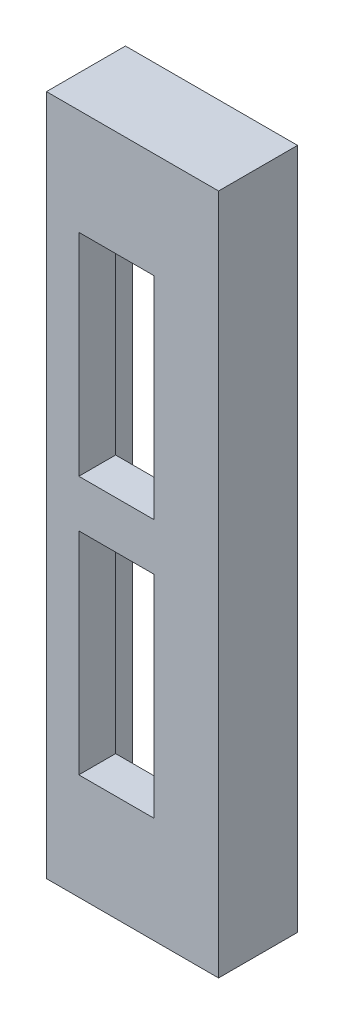
ISO-10303-21;
HEADER;
FILE_DESCRIPTION(('STEP AP214'),'2;1');
FILE_NAME('part.step','',(''),(''),'','','');
FILE_SCHEMA(('AUTOMOTIVE_DESIGN { 1 0 10303 214 1 1 1 1 }'));
ENDSEC;
DATA;
#1=APPLICATION_CONTEXT('core data for automotive mechanical design processes');
#2=APPLICATION_PROTOCOL_DEFINITION('international standard','automotive_design',2000,#1);
#3=PRODUCT_CONTEXT('',#1,'mechanical');
#4=PRODUCT('Part','Part','',(#3));
#5=PRODUCT_RELATED_PRODUCT_CATEGORY('part','',(#4));
#6=PRODUCT_DEFINITION_FORMATION('','',#4);
#7=PRODUCT_DEFINITION_CONTEXT('part definition',#1,'design');
#8=PRODUCT_DEFINITION('design','',#6,#7);
#9=PRODUCT_DEFINITION_SHAPE('','',#8);
#10=(LENGTH_UNIT() NAMED_UNIT(*) SI_UNIT(.MILLI.,.METRE.));
#11=(NAMED_UNIT(*) PLANE_ANGLE_UNIT() SI_UNIT($,.RADIAN.));
#12=(NAMED_UNIT(*) SI_UNIT($,.STERADIAN.) SOLID_ANGLE_UNIT());
#13=UNCERTAINTY_MEASURE_WITH_UNIT(LENGTH_MEASURE(1.E-05),#10,'distance_accuracy_value','');
#14=(GEOMETRIC_REPRESENTATION_CONTEXT(3) GLOBAL_UNCERTAINTY_ASSIGNED_CONTEXT((#13)) GLOBAL_UNIT_ASSIGNED_CONTEXT((#10,
#11,#12)) REPRESENTATION_CONTEXT('',''));
#15=CARTESIAN_POINT('',(0.,0.,0.));
#16=DIRECTION('',(0.,0.,1.));
#17=DIRECTION('',(1.,0.,0.));
#18=AXIS2_PLACEMENT_3D('',#15,#16,#17);
#19=CARTESIAN_POINT('',(0.,0.,3.81));
#20=DIRECTION('',(0.,0.,-1.));
#21=DIRECTION('',(-1.,0.,0.));
#22=AXIS2_PLACEMENT_3D('',#19,#20,#21);
#23=PLANE('',#22);
#24=DIRECTION('',(0.500000000000004,-0.866025403784436,0.));
#25=VECTOR('',#24,1.);
#26=CARTESIAN_POINT('',(19.9255461786053,11.5040194499682,3.81));
#27=LINE('',#26,#25);
#28=CARTESIAN_POINT('',(26.3139034313321,0.439060111344211,3.81));
#29=VERTEX_POINT('',#28);
#30=CARTESIAN_POINT('',(26.5497147250491,0.0306229696278772,3.81));
#31=VERTEX_POINT('',#30);
#32=EDGE_CURVE('E923',#29,#31,#27,.T.);
#33=ORIENTED_EDGE('',*,*,#32,.F.);
#34=DIRECTION('',(0.929308442313576,0.369304507208774,0.));
#35=VECTOR('',#34,1.);
#36=CARTESIAN_POINT('',(3.43815880907448,-8.65169513211885,3.81));
#37=LINE('',#36,#35);
#38=CARTESIAN_POINT('',(31.499999999999,2.49999999999999,3.81));
#39=VERTEX_POINT('',#38);
#40=EDGE_CURVE('E926',#29,#39,#37,.T.);
#41=ORIENTED_EDGE('',*,*,#40,.T.);
#42=DIRECTION('',(0.,1.,0.));
#43=VECTOR('',#42,1.);
#44=CARTESIAN_POINT('',(31.499999999999,2.05328178701975E-13,3.81));
#45=LINE('',#44,#43);
#46=CARTESIAN_POINT('',(31.4999999999987,35.5,3.81));
#47=VERTEX_POINT('',#46);
#48=EDGE_CURVE('E929',#39,#47,#45,.T.);
#49=ORIENTED_EDGE('',*,*,#48,.T.);
#50=DIRECTION('',(-0.929308442313484,0.369304507209006,0.));
#51=VECTOR('',#50,1.);
#52=CARTESIAN_POINT('',(16.4796750697619,41.4690340084192,3.81));
#53=LINE('',#52,#51);
#54=CARTESIAN_POINT('',(25.0832450413092,38.0500000000004,3.81));
#55=VERTEX_POINT('',#54);
#56=EDGE_CURVE('E931',#47,#55,#53,.T.);
#57=ORIENTED_EDGE('',*,*,#56,.T.);
#58=DIRECTION('',(-0.932489534644437,-0.361196993036488,0.));
#59=VECTOR('',#58,1.);
#60=CARTESIAN_POINT('',(-9.5432703123766,24.6375242987562,3.81));
#61=LINE('',#60,#59);
#62=CARTESIAN_POINT('',(18.4999999999988,35.5,3.81));
#63=VERTEX_POINT('',#62);
#64=EDGE_CURVE('E933',#55,#63,#61,.T.);
#65=ORIENTED_EDGE('',*,*,#64,.T.);
#66=DIRECTION('',(0.,-1.,0.));
#67=VECTOR('',#66,1.);
#68=CARTESIAN_POINT('',(18.499999999999,1.28369537222277E-13,3.81));
#69=LINE('',#68,#67);
#70=CARTESIAN_POINT('',(18.499999999999,2.5,3.81));
#71=VERTEX_POINT('',#70);
#72=EDGE_CURVE('E935',#63,#71,#69,.T.);
#73=ORIENTED_EDGE('',*,*,#72,.T.);
#74=DIRECTION('',(0.932489534644453,-0.361196993036448,0.));
#75=VECTOR('',#74,1.);
#76=CARTESIAN_POINT('',(3.25560149378227,8.40487152565658,3.81));
#77=LINE('',#76,#75);
#78=CARTESIAN_POINT('',(23.8467508819622,0.428952262379621,3.81));
#79=VERTEX_POINT('',#78);
#80=EDGE_CURVE('E937',#71,#79,#77,.T.);
#81=ORIENTED_EDGE('',*,*,#80,.T.);
#82=DIRECTION('',(0.499999999999997,0.866025403784441,0.));
#83=VECTOR('',#82,1.);
#84=CARTESIAN_POINT('',(17.6993213833559,-10.2187079651541,3.81));
#85=LINE('',#84,#83);
#86=CARTESIAN_POINT('',(23.6167753575658,0.030622969627879,3.81));
#87=VERTEX_POINT('',#86);
#88=EDGE_CURVE('E939',#87,#79,#85,.T.);
#89=ORIENTED_EDGE('',*,*,#88,.F.);
#90=DIRECTION('',(-0.500000000000071,0.866025403784398,0.));
#91=VECTOR('',#90,1.);
#92=CARTESIAN_POINT('',(17.7258416529912,10.2340194499691,3.81));
#93=LINE('',#92,#91);
#94=CARTESIAN_POINT('',(23.8467508819622,-0.367706323123848,3.81));
#95=VERTEX_POINT('',#94);
#96=EDGE_CURVE('E942',#95,#87,#93,.T.);
#97=ORIENTED_EDGE('',*,*,#96,.F.);
#98=DIRECTION('',(0.932489534644453,0.361196993036448,0.));
#99=VECTOR('',#98,1.);
#100=CARTESIAN_POINT('',(3.23497310101432,-8.35161593177429,3.81));
#101=LINE('',#100,#99);
#102=CARTESIAN_POINT('',(18.499999999999,-2.43875406074424,3.81));
#103=VERTEX_POINT('',#102);
#104=EDGE_CURVE('E945',#103,#95,#101,.T.);
#105=ORIENTED_EDGE('',*,*,#104,.F.);
#106=DIRECTION('',(0.,1.,0.));
#107=VECTOR('',#106,1.);
#108=CARTESIAN_POINT('',(18.499999999999,-1.28369537222277E-13,3.81));
#109=LINE('',#108,#107);
#110=CARTESIAN_POINT('',(18.4999999999988,-35.4387540607442,3.81));
#111=VERTEX_POINT('',#110);
#112=EDGE_CURVE('E948',#111,#103,#109,.T.);
#113=ORIENTED_EDGE('',*,*,#112,.F.);
#114=DIRECTION('',(-0.932489534644437,0.361196993036488,0.));
#115=VECTOR('',#114,1.);
#116=CARTESIAN_POINT('',(-9.52264191960864,-24.5842687048739,3.81));
#117=LINE('',#116,#115);
#118=CARTESIAN_POINT('',(25.0832450413092,-37.9887540607447,3.81));
#119=VERTEX_POINT('',#118);
#120=EDGE_CURVE('E951',#119,#111,#117,.T.);
#121=ORIENTED_EDGE('',*,*,#120,.F.);
#122=DIRECTION('',(-0.929308442313484,-0.369304507209006,0.));
#123=VECTOR('',#122,1.);
#124=CARTESIAN_POINT('',(16.4586555983749,-41.416141146752,3.81));
#125=LINE('',#124,#123);
#126=CARTESIAN_POINT('',(31.4999999999987,-35.4387540607442,3.81));
#127=VERTEX_POINT('',#126);
#128=EDGE_CURVE('E954',#127,#119,#125,.T.);
#129=ORIENTED_EDGE('',*,*,#128,.F.);
#130=DIRECTION('',(0.,-1.,0.));
#131=VECTOR('',#130,1.);
#132=CARTESIAN_POINT('',(31.499999999999,-2.05328178701975E-13,3.81));
#133=LINE('',#132,#131);
#134=CARTESIAN_POINT('',(31.499999999999,-2.43875406074423,3.81));
#135=VERTEX_POINT('',#134);
#136=EDGE_CURVE('E957',#135,#127,#133,.T.);
#137=ORIENTED_EDGE('',*,*,#136,.F.);
#138=DIRECTION('',(0.929308442313576,-0.369304507208774,0.));
#139=VECTOR('',#138,1.);
#140=CARTESIAN_POINT('',(3.45917828046144,8.70458799378605,3.81));
#141=LINE('',#140,#139);
#142=CARTESIAN_POINT('',(26.3139034313321,-0.377814172088448,3.81));
#143=VERTEX_POINT('',#142);
#144=EDGE_CURVE('E960',#143,#135,#141,.T.);
#145=ORIENTED_EDGE('',*,*,#144,.F.);
#146=DIRECTION('',(-0.500000000000057,-0.866025403784406,0.));
#147=VECTOR('',#146,1.);
#148=CARTESIAN_POINT('',(19.8990259089668,-11.4887079651551,3.81));
#149=LINE('',#148,#147);
#150=EDGE_CURVE('E963',#31,#143,#149,.T.);
#151=ORIENTED_EDGE('',*,*,#150,.F.);
#152=EDGE_LOOP('',(#33,#41,#49,#57,#65,#73,#81,#89,#97,#105,#113,#121,#129,#137,#145,#151));
#153=FACE_BOUND('',#152,.T.);
#154=DIRECTION('',(-1.,0.,0.));
#155=VECTOR('',#154,1.);
#156=CARTESIAN_POINT('',(0.,-49.25,3.81));
#157=LINE('',#156,#155);
#158=CARTESIAN_POINT('',(39.2,-49.25,3.81));
#159=VERTEX_POINT('',#158);
#160=CARTESIAN_POINT('',(15.7500000000006,-49.25,3.81));
#161=VERTEX_POINT('',#160);
#162=EDGE_CURVE('E918',#159,#161,#157,.T.);
#163=ORIENTED_EDGE('',*,*,#162,.T.);
#164=DIRECTION('',(0.,1.,0.));
#165=VECTOR('',#164,1.);
#166=CARTESIAN_POINT('',(15.7500000000006,0.,3.81));
#167=LINE('',#166,#165);
#168=CARTESIAN_POINT('',(15.7500000000006,49.25,3.81));
#169=VERTEX_POINT('',#168);
#170=EDGE_CURVE('E672',#161,#169,#167,.T.);
#171=ORIENTED_EDGE('',*,*,#170,.T.);
#172=DIRECTION('',(1.,0.,0.));
#173=VECTOR('',#172,1.);
#174=CARTESIAN_POINT('',(0.,49.25,3.81));
#175=LINE('',#174,#173);
#176=CARTESIAN_POINT('',(39.2,49.25,3.81));
#177=VERTEX_POINT('',#176);
#178=EDGE_CURVE('E920',#169,#177,#175,.T.);
#179=ORIENTED_EDGE('',*,*,#178,.T.);
#180=CARTESIAN_POINT('',(39.2,49.2,3.81));
#181=DIRECTION('',(0.,0.,-1.));
#182=DIRECTION('',(-1.,0.,0.));
#183=AXIS2_PLACEMENT_3D('',#180,#181,#182);
#184=CIRCLE('',#183,0.05);
#185=CARTESIAN_POINT('',(39.25,49.2,3.81));
#186=VERTEX_POINT('',#185);
#187=EDGE_CURVE('E1124',#177,#186,#184,.T.);
#188=ORIENTED_EDGE('',*,*,#187,.T.);
#189=DIRECTION('',(0.,-1.,0.));
#190=VECTOR('',#189,1.);
#191=CARTESIAN_POINT('',(39.25,0.,3.81));
#192=LINE('',#191,#190);
#193=CARTESIAN_POINT('',(39.25,-49.2,3.81));
#194=VERTEX_POINT('',#193);
#195=EDGE_CURVE('E915',#186,#194,#192,.T.);
#196=ORIENTED_EDGE('',*,*,#195,.T.);
#197=CARTESIAN_POINT('',(39.2,-49.2,3.81));
#198=DIRECTION('',(0.,0.,-1.));
#199=DIRECTION('',(-1.,0.,0.));
#200=AXIS2_PLACEMENT_3D('',#197,#198,#199);
#201=CIRCLE('',#200,0.05);
#202=EDGE_CURVE('E1126',#194,#159,#201,.T.);
#203=ORIENTED_EDGE('',*,*,#202,.T.);
#204=EDGE_LOOP('',(#163,#171,#179,#188,#196,#203));
#205=FACE_BOUND('',#204,.T.);
#206=ADVANCED_FACE('F650',(#153,#205),#23,.T.);
#207=CARTESIAN_POINT('',(0.,-49.25,3.81));
#208=DIRECTION('',(0.,-1.,0.));
#209=DIRECTION('',(0.,0.,-1.));
#210=AXIS2_PLACEMENT_3D('',#207,#208,#209);
#211=PLANE('',#210);
#212=DIRECTION('',(0.,0.,-1.));
#213=VECTOR('',#212,1.);
#214=CARTESIAN_POINT('',(15.7500000000006,-49.25,3.81));
#215=LINE('',#214,#213);
#216=CARTESIAN_POINT('',(15.7500000000006,-49.25,-6.191));
#217=VERTEX_POINT('',#216);
#218=EDGE_CURVE('E665',#161,#217,#215,.T.);
#219=ORIENTED_EDGE('',*,*,#218,.F.);
#220=ORIENTED_EDGE('',*,*,#162,.F.);
#221=DIRECTION('',(0.,0.,-1.));
#222=VECTOR('',#221,1.);
#223=CARTESIAN_POINT('',(39.2,-49.25,0.));
#224=LINE('',#223,#222);
#225=CARTESIAN_POINT('',(39.2,-49.25,-6.191));
#226=VERTEX_POINT('',#225);
#227=EDGE_CURVE('E1118',#159,#226,#224,.T.);
#228=ORIENTED_EDGE('',*,*,#227,.T.);
#229=DIRECTION('',(-1.,0.,0.));
#230=VECTOR('',#229,1.);
#231=CARTESIAN_POINT('',(39.2,-49.25,-6.191));
#232=LINE('',#231,#230);
#233=EDGE_CURVE('E904',#226,#217,#232,.T.);
#234=ORIENTED_EDGE('',*,*,#233,.T.);
#235=EDGE_LOOP('',(#219,#220,#228,#234));
#236=FACE_BOUND('',#235,.T.);
#237=ADVANCED_FACE('F1147',(#236),#211,.F.);
#238=CARTESIAN_POINT('',(0.,49.25,3.81));
#239=DIRECTION('',(0.,1.,0.));
#240=DIRECTION('',(0.,0.,1.));
#241=AXIS2_PLACEMENT_3D('',#238,#239,#240);
#242=PLANE('',#241);
#243=DIRECTION('',(0.,0.,1.));
#244=VECTOR('',#243,1.);
#245=CARTESIAN_POINT('',(15.7500000000006,49.25,3.81));
#246=LINE('',#245,#244);
#247=CARTESIAN_POINT('',(15.7500000000006,49.25,-6.191));
#248=VERTEX_POINT('',#247);
#249=EDGE_CURVE('E1153',#248,#169,#246,.T.);
#250=ORIENTED_EDGE('',*,*,#249,.F.);
#251=DIRECTION('',(1.,0.,0.));
#252=VECTOR('',#251,1.);
#253=CARTESIAN_POINT('',(-39.2,49.25,-6.191));
#254=LINE('',#253,#252);
#255=CARTESIAN_POINT('',(39.2,49.25,-6.191));
#256=VERTEX_POINT('',#255);
#257=EDGE_CURVE('E906',#248,#256,#254,.T.);
#258=ORIENTED_EDGE('',*,*,#257,.T.);
#259=DIRECTION('',(0.,0.,-1.));
#260=VECTOR('',#259,1.);
#261=CARTESIAN_POINT('',(39.2,49.25,3.81));
#262=LINE('',#261,#260);
#263=EDGE_CURVE('E658',#256,#177,#262,.F.);
#264=ORIENTED_EDGE('',*,*,#263,.T.);
#265=ORIENTED_EDGE('',*,*,#178,.F.);
#266=EDGE_LOOP('',(#250,#258,#264,#265));
#267=FACE_BOUND('',#266,.T.);
#268=ADVANCED_FACE('F1131',(#267),#242,.F.);
#269=CARTESIAN_POINT('',(14.7500000000006,52.8592862313909,5.3975));
#270=DIRECTION('',(1.,0.,0.));
#271=DIRECTION('',(0.,1.,0.));
#272=AXIS2_PLACEMENT_3D('',#269,#270,#271);
#273=PLANE('',#272);
#274=DIRECTION('',(0.,0.,1.));
#275=VECTOR('',#274,1.);
#276=CARTESIAN_POINT('',(14.7500000000006,50.,5.3975));
#277=LINE('',#276,#275);
#278=CARTESIAN_POINT('',(14.7500000000006,50.,-6.191));
#279=VERTEX_POINT('',#278);
#280=CARTESIAN_POINT('',(14.7500000000006,50.,5.3975));
#281=VERTEX_POINT('',#280);
#282=EDGE_CURVE('E891',#279,#281,#277,.T.);
#283=ORIENTED_EDGE('',*,*,#282,.F.);
#284=DIRECTION('',(0.,-1.,0.));
#285=VECTOR('',#284,1.);
#286=CARTESIAN_POINT('',(14.7500000000006,0.,-6.191));
#287=LINE('',#286,#285);
#288=CARTESIAN_POINT('',(14.7500000000006,-50.,-6.191));
#289=VERTEX_POINT('',#288);
#290=EDGE_CURVE('E12',#279,#289,#287,.T.);
#291=ORIENTED_EDGE('',*,*,#290,.T.);
#292=DIRECTION('',(0.,0.,-1.));
#293=VECTOR('',#292,1.);
#294=CARTESIAN_POINT('',(14.7500000000006,-50.,5.3975));
#295=LINE('',#294,#293);
#296=CARTESIAN_POINT('',(14.7500000000006,-50.,5.3975));
#297=VERTEX_POINT('',#296);
#298=EDGE_CURVE('E888',#297,#289,#295,.T.);
#299=ORIENTED_EDGE('',*,*,#298,.F.);
#300=DIRECTION('',(0.,-1.,0.));
#301=VECTOR('',#300,1.);
#302=CARTESIAN_POINT('',(14.7500000000006,52.8592862313909,5.3975));
#303=LINE('',#302,#301);
#304=EDGE_CURVE('E895',#281,#297,#303,.T.);
#305=ORIENTED_EDGE('',*,*,#304,.F.);
#306=EDGE_LOOP('',(#283,#291,#299,#305));
#307=FACE_BOUND('',#306,.T.);
#308=ADVANCED_FACE('F886',(#307),#273,.F.);
#309=CARTESIAN_POINT('',(0.,0.,5.3975));
#310=DIRECTION('',(0.,0.,-1.));
#311=DIRECTION('',(-1.,0.,0.));
#312=AXIS2_PLACEMENT_3D('',#309,#310,#311);
#313=PLANE('',#312);
#314=DIRECTION('',(1.,0.,0.));
#315=VECTOR('',#314,1.);
#316=CARTESIAN_POINT('',(40.,-50.,5.3975));
#317=LINE('',#316,#315);
#318=CARTESIAN_POINT('',(40.,-50.,5.3975));
#319=VERTEX_POINT('',#318);
#320=EDGE_CURVE('E894',#297,#319,#317,.T.);
#321=ORIENTED_EDGE('',*,*,#320,.T.);
#322=DIRECTION('',(0.,1.,0.));
#323=VECTOR('',#322,1.);
#324=CARTESIAN_POINT('',(40.,50.,5.3975));
#325=LINE('',#324,#323);
#326=CARTESIAN_POINT('',(40.,50.,5.3975));
#327=VERTEX_POINT('',#326);
#328=EDGE_CURVE('E1107',#319,#327,#325,.T.);
#329=ORIENTED_EDGE('',*,*,#328,.T.);
#330=DIRECTION('',(-1.,0.,0.));
#331=VECTOR('',#330,1.);
#332=CARTESIAN_POINT('',(-40.,50.,5.3975));
#333=LINE('',#332,#331);
#334=EDGE_CURVE('E1110',#327,#281,#333,.T.);
#335=ORIENTED_EDGE('',*,*,#334,.T.);
#336=ORIENTED_EDGE('',*,*,#304,.T.);
#337=EDGE_LOOP('',(#321,#329,#335,#336));
#338=FACE_BOUND('',#337,.T.);
#339=DIRECTION('',(0.,1.,0.));
#340=VECTOR('',#339,1.);
#341=CARTESIAN_POINT('',(30.499999999999,-3.43875406074425,5.3975));
#342=LINE('',#341,#340);
#343=CARTESIAN_POINT('',(30.4999999999988,-34.4387540607442,5.3975));
#344=VERTEX_POINT('',#343);
#345=CARTESIAN_POINT('',(30.499999999999,-3.43875406074425,5.3975));
#346=VERTEX_POINT('',#345);
#347=EDGE_CURVE('E1073',#344,#346,#342,.T.);
#348=ORIENTED_EDGE('',*,*,#347,.F.);
#349=DIRECTION('',(1.,0.,0.));
#350=VECTOR('',#349,1.);
#351=CARTESIAN_POINT('',(30.4999999999988,-34.4387540607442,5.3975));
#352=LINE('',#351,#350);
#353=CARTESIAN_POINT('',(19.4999999999988,-34.4387540607442,5.3975));
#354=VERTEX_POINT('',#353);
#355=EDGE_CURVE('E1080',#354,#344,#352,.T.);
#356=ORIENTED_EDGE('',*,*,#355,.F.);
#357=DIRECTION('',(0.,-1.,0.));
#358=VECTOR('',#357,1.);
#359=CARTESIAN_POINT('',(19.4999999999988,-34.4387540607442,5.3975));
#360=LINE('',#359,#358);
#361=CARTESIAN_POINT('',(19.499999999999,-3.43875406074425,5.3975));
#362=VERTEX_POINT('',#361);
#363=EDGE_CURVE('E1077',#362,#354,#360,.T.);
#364=ORIENTED_EDGE('',*,*,#363,.F.);
#365=DIRECTION('',(-1.,0.,0.));
#366=VECTOR('',#365,1.);
#367=CARTESIAN_POINT('',(19.499999999999,-3.43875406074425,5.3975));
#368=LINE('',#367,#366);
#369=EDGE_CURVE('E1075',#346,#362,#368,.T.);
#370=ORIENTED_EDGE('',*,*,#369,.F.);
#371=EDGE_LOOP('',(#348,#356,#364,#370));
#372=FACE_BOUND('',#371,.T.);
#373=DIRECTION('',(0.,-1.,0.));
#374=VECTOR('',#373,1.);
#375=CARTESIAN_POINT('',(19.4999999999988,34.5,5.3975));
#376=LINE('',#375,#374);
#377=CARTESIAN_POINT('',(19.4999999999988,34.5,5.3975));
#378=VERTEX_POINT('',#377);
#379=CARTESIAN_POINT('',(19.499999999999,3.50000000000001,5.3975));
#380=VERTEX_POINT('',#379);
#381=EDGE_CURVE('E1090',#378,#380,#376,.T.);
#382=ORIENTED_EDGE('',*,*,#381,.F.);
#383=DIRECTION('',(-1.,0.,0.));
#384=VECTOR('',#383,1.);
#385=CARTESIAN_POINT('',(30.4999999999988,34.5,5.3975));
#386=LINE('',#385,#384);
#387=CARTESIAN_POINT('',(30.4999999999988,34.5,5.3975));
#388=VERTEX_POINT('',#387);
#389=EDGE_CURVE('E1097',#388,#378,#386,.T.);
#390=ORIENTED_EDGE('',*,*,#389,.F.);
#391=DIRECTION('',(0.,1.,0.));
#392=VECTOR('',#391,1.);
#393=CARTESIAN_POINT('',(30.499999999999,3.50000000000001,5.3975));
#394=LINE('',#393,#392);
#395=CARTESIAN_POINT('',(30.499999999999,3.50000000000001,5.3975));
#396=VERTEX_POINT('',#395);
#397=EDGE_CURVE('E1094',#396,#388,#394,.T.);
#398=ORIENTED_EDGE('',*,*,#397,.F.);
#399=DIRECTION('',(1.,0.,0.));
#400=VECTOR('',#399,1.);
#401=CARTESIAN_POINT('',(19.499999999999,3.50000000000001,5.3975));
#402=LINE('',#401,#400);
#403=EDGE_CURVE('E1092',#380,#396,#402,.T.);
#404=ORIENTED_EDGE('',*,*,#403,.F.);
#405=EDGE_LOOP('',(#382,#390,#398,#404));
#406=FACE_BOUND('',#405,.T.);
#407=ADVANCED_FACE('F1175',(#338,#372,#406),#313,.F.);
#408=CARTESIAN_POINT('',(40.,50.,5.3975));
#409=DIRECTION('',(-1.,0.,0.));
#410=DIRECTION('',(0.,-1.,0.));
#411=AXIS2_PLACEMENT_3D('',#408,#409,#410);
#412=PLANE('',#411);
#413=DIRECTION('',(0.,0.,-1.));
#414=VECTOR('',#413,1.);
#415=CARTESIAN_POINT('',(40.,-50.,5.3975));
#416=LINE('',#415,#414);
#417=CARTESIAN_POINT('',(40.,-50.,-6.191));
#418=VERTEX_POINT('',#417);
#419=EDGE_CURVE('E1113',#319,#418,#416,.T.);
#420=ORIENTED_EDGE('',*,*,#419,.T.);
#421=DIRECTION('',(0.,-1.,0.));
#422=VECTOR('',#421,1.);
#423=CARTESIAN_POINT('',(40.,50.,-6.191));
#424=LINE('',#423,#422);
#425=CARTESIAN_POINT('',(40.,50.,-6.191));
#426=VERTEX_POINT('',#425);
#427=EDGE_CURVE('E877',#426,#418,#424,.T.);
#428=ORIENTED_EDGE('',*,*,#427,.F.);
#429=DIRECTION('',(0.,0.,-1.));
#430=VECTOR('',#429,1.);
#431=CARTESIAN_POINT('',(40.,50.,5.3975));
#432=LINE('',#431,#430);
#433=EDGE_CURVE('E1115',#327,#426,#432,.T.);
#434=ORIENTED_EDGE('',*,*,#433,.F.);
#435=ORIENTED_EDGE('',*,*,#328,.F.);
#436=EDGE_LOOP('',(#420,#428,#434,#435));
#437=FACE_BOUND('',#436,.T.);
#438=ADVANCED_FACE('F1183',(#437),#412,.F.);
#439=CARTESIAN_POINT('',(-40.,50.,5.3975));
#440=DIRECTION('',(0.,-1.,0.));
#441=DIRECTION('',(1.,0.,0.));
#442=AXIS2_PLACEMENT_3D('',#439,#440,#441);
#443=PLANE('',#442);
#444=ORIENTED_EDGE('',*,*,#282,.T.);
#445=ORIENTED_EDGE('',*,*,#334,.F.);
#446=ORIENTED_EDGE('',*,*,#433,.T.);
#447=DIRECTION('',(1.,0.,0.));
#448=VECTOR('',#447,1.);
#449=CARTESIAN_POINT('',(-40.,50.,-6.191));
#450=LINE('',#449,#448);
#451=EDGE_CURVE('E881',#279,#426,#450,.T.);
#452=ORIENTED_EDGE('',*,*,#451,.F.);
#453=EDGE_LOOP('',(#444,#445,#446,#452));
#454=FACE_BOUND('',#453,.T.);
#455=ADVANCED_FACE('F1180',(#454),#443,.F.);
#456=CARTESIAN_POINT('',(40.,-50.,5.3975));
#457=DIRECTION('',(0.,1.,0.));
#458=DIRECTION('',(-1.,0.,0.));
#459=AXIS2_PLACEMENT_3D('',#456,#457,#458);
#460=PLANE('',#459);
#461=ORIENTED_EDGE('',*,*,#298,.T.);
#462=DIRECTION('',(-1.,0.,0.));
#463=VECTOR('',#462,1.);
#464=CARTESIAN_POINT('',(40.,-50.,-6.191));
#465=LINE('',#464,#463);
#466=EDGE_CURVE('E872',#418,#289,#465,.T.);
#467=ORIENTED_EDGE('',*,*,#466,.F.);
#468=ORIENTED_EDGE('',*,*,#419,.F.);
#469=ORIENTED_EDGE('',*,*,#320,.F.);
#470=EDGE_LOOP('',(#461,#467,#468,#469));
#471=FACE_BOUND('',#470,.T.);
#472=ADVANCED_FACE('F893',(#471),#460,.F.);
#473=CARTESIAN_POINT('',(19.4999999999988,34.5,5.3975));
#474=DIRECTION('',(1.,0.,0.));
#475=DIRECTION('',(0.,1.,0.));
#476=AXIS2_PLACEMENT_3D('',#473,#474,#475);
#477=PLANE('',#476);
#478=DIRECTION('',(0.,0.,-1.));
#479=VECTOR('',#478,1.);
#480=CARTESIAN_POINT('',(19.499999999999,3.50000000000001,5.3975));
#481=LINE('',#480,#479);
#482=CARTESIAN_POINT('',(19.499999999999,3.50000000000001,0.));
#483=VERTEX_POINT('',#482);
#484=EDGE_CURVE('E1105',#380,#483,#481,.T.);
#485=ORIENTED_EDGE('',*,*,#484,.T.);
#486=DIRECTION('',(0.,-1.,0.));
#487=VECTOR('',#486,1.);
#488=CARTESIAN_POINT('',(19.499999999999,1.35308431126184E-13,0.));
#489=LINE('',#488,#487);
#490=CARTESIAN_POINT('',(19.4999999999988,34.5,0.));
#491=VERTEX_POINT('',#490);
#492=EDGE_CURVE('E972',#491,#483,#489,.T.);
#493=ORIENTED_EDGE('',*,*,#492,.F.);
#494=DIRECTION('',(0.,0.,-1.));
#495=VECTOR('',#494,1.);
#496=CARTESIAN_POINT('',(19.4999999999988,34.5,5.3975));
#497=LINE('',#496,#495);
#498=EDGE_CURVE('E1099',#378,#491,#497,.T.);
#499=ORIENTED_EDGE('',*,*,#498,.F.);
#500=ORIENTED_EDGE('',*,*,#381,.T.);
#501=EDGE_LOOP('',(#485,#493,#499,#500));
#502=FACE_BOUND('',#501,.T.);
#503=ADVANCED_FACE('F1179',(#502),#477,.T.);
#504=CARTESIAN_POINT('',(19.499999999999,3.50000000000001,5.3975));
#505=DIRECTION('',(0.,1.,0.));
#506=DIRECTION('',(-1.,0.,0.));
#507=AXIS2_PLACEMENT_3D('',#504,#505,#506);
#508=PLANE('',#507);
#509=DIRECTION('',(0.,0.,-1.));
#510=VECTOR('',#509,1.);
#511=CARTESIAN_POINT('',(30.499999999999,3.50000000000001,5.3975));
#512=LINE('',#511,#510);
#513=CARTESIAN_POINT('',(30.499999999999,3.50000000000001,0.));
#514=VERTEX_POINT('',#513);
#515=EDGE_CURVE('E1103',#396,#514,#512,.T.);
#516=ORIENTED_EDGE('',*,*,#515,.T.);
#517=DIRECTION('',(1.,0.,0.));
#518=VECTOR('',#517,1.);
#519=CARTESIAN_POINT('',(0.,3.5,0.));
#520=LINE('',#519,#518);
#521=EDGE_CURVE('E969',#483,#514,#520,.T.);
#522=ORIENTED_EDGE('',*,*,#521,.F.);
#523=ORIENTED_EDGE('',*,*,#484,.F.);
#524=ORIENTED_EDGE('',*,*,#403,.T.);
#525=EDGE_LOOP('',(#516,#522,#523,#524));
#526=FACE_BOUND('',#525,.T.);
#527=ADVANCED_FACE('F1286',(#526),#508,.T.);
#528=CARTESIAN_POINT('',(30.499999999999,3.50000000000001,5.3975));
#529=DIRECTION('',(-1.,0.,0.));
#530=DIRECTION('',(0.,-1.,0.));
#531=AXIS2_PLACEMENT_3D('',#528,#529,#530);
#532=PLANE('',#531);
#533=DIRECTION('',(0.,0.,-1.));
#534=VECTOR('',#533,1.);
#535=CARTESIAN_POINT('',(30.4999999999988,34.5,5.3975));
#536=LINE('',#535,#534);
#537=CARTESIAN_POINT('',(30.4999999999988,34.5,0.));
#538=VERTEX_POINT('',#537);
#539=EDGE_CURVE('E1101',#388,#538,#536,.T.);
#540=ORIENTED_EDGE('',*,*,#539,.T.);
#541=DIRECTION('',(0.,1.,0.));
#542=VECTOR('',#541,1.);
#543=CARTESIAN_POINT('',(30.499999999999,2.11636264069164E-13,0.));
#544=LINE('',#543,#542);
#545=EDGE_CURVE('E922',#514,#538,#544,.T.);
#546=ORIENTED_EDGE('',*,*,#545,.F.);
#547=ORIENTED_EDGE('',*,*,#515,.F.);
#548=ORIENTED_EDGE('',*,*,#397,.T.);
#549=EDGE_LOOP('',(#540,#546,#547,#548));
#550=FACE_BOUND('',#549,.T.);
#551=ADVANCED_FACE('F1282',(#550),#532,.T.);
#552=CARTESIAN_POINT('',(30.4999999999988,34.5,5.3975));
#553=DIRECTION('',(0.,-1.,0.));
#554=DIRECTION('',(0.,0.,-1.));
#555=AXIS2_PLACEMENT_3D('',#552,#553,#554);
#556=PLANE('',#555);
#557=ORIENTED_EDGE('',*,*,#498,.T.);
#558=DIRECTION('',(-1.,0.,0.));
#559=VECTOR('',#558,1.);
#560=CARTESIAN_POINT('',(0.,34.5,0.));
#561=LINE('',#560,#559);
#562=EDGE_CURVE('E975',#538,#491,#561,.T.);
#563=ORIENTED_EDGE('',*,*,#562,.F.);
#564=ORIENTED_EDGE('',*,*,#539,.F.);
#565=ORIENTED_EDGE('',*,*,#389,.T.);
#566=EDGE_LOOP('',(#557,#563,#564,#565));
#567=FACE_BOUND('',#566,.T.);
#568=ADVANCED_FACE('F1278',(#567),#556,.T.);
#569=CARTESIAN_POINT('',(30.499999999999,-3.43875406074425,5.3975));
#570=DIRECTION('',(-1.,0.,0.));
#571=DIRECTION('',(0.,-1.,0.));
#572=AXIS2_PLACEMENT_3D('',#569,#570,#571);
#573=PLANE('',#572);
#574=DIRECTION('',(0.,0.,-1.));
#575=VECTOR('',#574,1.);
#576=CARTESIAN_POINT('',(30.499999999999,-3.43875406074425,5.3975));
#577=LINE('',#576,#575);
#578=CARTESIAN_POINT('',(30.499999999999,-3.43875406074425,0.));
#579=VERTEX_POINT('',#578);
#580=EDGE_CURVE('E1088',#346,#579,#577,.T.);
#581=ORIENTED_EDGE('',*,*,#580,.T.);
#582=DIRECTION('',(0.,-1.,0.));
#583=VECTOR('',#582,1.);
#584=CARTESIAN_POINT('',(30.499999999999,-2.11636264069164E-13,0.));
#585=LINE('',#584,#583);
#586=CARTESIAN_POINT('',(30.4999999999988,-34.4387540607442,0.));
#587=VERTEX_POINT('',#586);
#588=EDGE_CURVE('E984',#579,#587,#585,.T.);
#589=ORIENTED_EDGE('',*,*,#588,.T.);
#590=DIRECTION('',(0.,0.,-1.));
#591=VECTOR('',#590,1.);
#592=CARTESIAN_POINT('',(30.4999999999988,-34.4387540607442,5.3975));
#593=LINE('',#592,#591);
#594=EDGE_CURVE('E1082',#344,#587,#593,.T.);
#595=ORIENTED_EDGE('',*,*,#594,.F.);
#596=ORIENTED_EDGE('',*,*,#347,.T.);
#597=EDGE_LOOP('',(#581,#589,#595,#596));
#598=FACE_BOUND('',#597,.T.);
#599=ADVANCED_FACE('F1274',(#598),#573,.T.);
#600=CARTESIAN_POINT('',(19.499999999999,-3.43875406074425,5.3975));
#601=DIRECTION('',(0.,-1.,0.));
#602=DIRECTION('',(1.,0.,0.));
#603=AXIS2_PLACEMENT_3D('',#600,#601,#602);
#604=PLANE('',#603);
#605=DIRECTION('',(0.,0.,-1.));
#606=VECTOR('',#605,1.);
#607=CARTESIAN_POINT('',(19.499999999999,-3.43875406074425,5.3975));
#608=LINE('',#607,#606);
#609=CARTESIAN_POINT('',(19.499999999999,-3.43875406074425,0.));
#610=VERTEX_POINT('',#609);
#611=EDGE_CURVE('E1086',#362,#610,#608,.T.);
#612=ORIENTED_EDGE('',*,*,#611,.T.);
#613=DIRECTION('',(1.,0.,0.));
#614=VECTOR('',#613,1.);
#615=CARTESIAN_POINT('',(0.,-3.43875406074425,0.));
#616=LINE('',#615,#614);
#617=EDGE_CURVE('E981',#610,#579,#616,.T.);
#618=ORIENTED_EDGE('',*,*,#617,.T.);
#619=ORIENTED_EDGE('',*,*,#580,.F.);
#620=ORIENTED_EDGE('',*,*,#369,.T.);
#621=EDGE_LOOP('',(#612,#618,#619,#620));
#622=FACE_BOUND('',#621,.T.);
#623=ADVANCED_FACE('F1270',(#622),#604,.T.);
#624=CARTESIAN_POINT('',(19.4999999999988,-34.4387540607442,5.3975));
#625=DIRECTION('',(1.,0.,0.));
#626=DIRECTION('',(0.,1.,0.));
#627=AXIS2_PLACEMENT_3D('',#624,#625,#626);
#628=PLANE('',#627);
#629=DIRECTION('',(0.,0.,-1.));
#630=VECTOR('',#629,1.);
#631=CARTESIAN_POINT('',(19.4999999999988,-34.4387540607442,5.3975));
#632=LINE('',#631,#630);
#633=CARTESIAN_POINT('',(19.4999999999988,-34.4387540607442,0.));
#634=VERTEX_POINT('',#633);
#635=EDGE_CURVE('E1084',#354,#634,#632,.T.);
#636=ORIENTED_EDGE('',*,*,#635,.T.);
#637=DIRECTION('',(0.,1.,0.));
#638=VECTOR('',#637,1.);
#639=CARTESIAN_POINT('',(19.499999999999,-1.35308431126184E-13,0.));
#640=LINE('',#639,#638);
#641=EDGE_CURVE('E978',#634,#610,#640,.T.);
#642=ORIENTED_EDGE('',*,*,#641,.T.);
#643=ORIENTED_EDGE('',*,*,#611,.F.);
#644=ORIENTED_EDGE('',*,*,#363,.T.);
#645=EDGE_LOOP('',(#636,#642,#643,#644));
#646=FACE_BOUND('',#645,.T.);
#647=ADVANCED_FACE('F1266',(#646),#628,.T.);
#648=CARTESIAN_POINT('',(30.4999999999988,-34.4387540607442,5.3975));
#649=DIRECTION('',(0.,1.,0.));
#650=DIRECTION('',(0.,0.,1.));
#651=AXIS2_PLACEMENT_3D('',#648,#649,#650);
#652=PLANE('',#651);
#653=ORIENTED_EDGE('',*,*,#594,.T.);
#654=DIRECTION('',(-1.,0.,0.));
#655=VECTOR('',#654,1.);
#656=CARTESIAN_POINT('',(0.,-34.4387540607442,0.));
#657=LINE('',#656,#655);
#658=EDGE_CURVE('E987',#587,#634,#657,.T.);
#659=ORIENTED_EDGE('',*,*,#658,.T.);
#660=ORIENTED_EDGE('',*,*,#635,.F.);
#661=ORIENTED_EDGE('',*,*,#355,.T.);
#662=EDGE_LOOP('',(#653,#659,#660,#661));
#663=FACE_BOUND('',#662,.T.);
#664=ADVANCED_FACE('F1262',(#663),#652,.T.);
#665=CARTESIAN_POINT('',(19.9255461786053,11.5040194499682,3.81));
#666=DIRECTION('',(0.866025403784436,0.500000000000004,0.));
#667=DIRECTION('',(-0.500000000000004,0.866025403784436,0.));
#668=AXIS2_PLACEMENT_3D('',#665,#666,#667);
#669=PLANE('',#668);
#670=DIRECTION('',(0.500000000000004,-0.866025403784436,0.));
#671=VECTOR('',#670,1.);
#672=CARTESIAN_POINT('',(19.9255461786053,11.5040194499682,0.));
#673=LINE('',#672,#671);
#674=CARTESIAN_POINT('',(26.3139034313321,0.439060111344218,0.));
#675=VERTEX_POINT('',#674);
#676=CARTESIAN_POINT('',(26.5497147250491,0.0306229696278772,0.));
#677=VERTEX_POINT('',#676);
#678=EDGE_CURVE('E990',#675,#677,#673,.T.);
#679=ORIENTED_EDGE('',*,*,#678,.F.);
#680=DIRECTION('',(0.,0.,-1.));
#681=VECTOR('',#680,1.);
#682=CARTESIAN_POINT('',(26.3139034313321,0.439060111344218,3.81));
#683=LINE('',#682,#681);
#684=EDGE_CURVE('E1071',#29,#675,#683,.T.);
#685=ORIENTED_EDGE('',*,*,#684,.F.);
#686=ORIENTED_EDGE('',*,*,#32,.T.);
#687=DIRECTION('',(0.,0.,-1.));
#688=VECTOR('',#687,1.);
#689=CARTESIAN_POINT('',(26.5497147250491,0.0306229696278772,3.81));
#690=LINE('',#689,#688);
#691=EDGE_CURVE('E966',#31,#677,#690,.T.);
#692=ORIENTED_EDGE('',*,*,#691,.T.);
#693=EDGE_LOOP('',(#679,#685,#686,#692));
#694=FACE_BOUND('',#693,.T.);
#695=ADVANCED_FACE('F1258',(#694),#669,.T.);
#696=CARTESIAN_POINT('',(3.43815880907448,-8.65169513211885,3.81));
#697=DIRECTION('',(-0.369304507208774,0.929308442313576,0.));
#698=DIRECTION('',(-0.929308442313576,-0.369304507208774,0.));
#699=AXIS2_PLACEMENT_3D('',#696,#697,#698);
#700=PLANE('',#699);
#701=DIRECTION('',(0.929308442313576,0.369304507208774,0.));
#702=VECTOR('',#701,1.);
#703=CARTESIAN_POINT('',(3.43815880907448,-8.65169513211885,0.));
#704=LINE('',#703,#702);
#705=CARTESIAN_POINT('',(31.499999999999,2.49999999999999,0.));
#706=VERTEX_POINT('',#705);
#707=EDGE_CURVE('E993',#675,#706,#704,.T.);
#708=ORIENTED_EDGE('',*,*,#707,.T.);
#709=DIRECTION('',(0.,0.,-1.));
#710=VECTOR('',#709,1.);
#711=CARTESIAN_POINT('',(31.499999999999,2.49999999999999,3.81));
#712=LINE('',#711,#710);
#713=EDGE_CURVE('E1068',#39,#706,#712,.T.);
#714=ORIENTED_EDGE('',*,*,#713,.F.);
#715=ORIENTED_EDGE('',*,*,#40,.F.);
#716=ORIENTED_EDGE('',*,*,#684,.T.);
#717=EDGE_LOOP('',(#708,#714,#715,#716));
#718=FACE_BOUND('',#717,.T.);
#719=ADVANCED_FACE('F1254',(#718),#700,.F.);
#720=CARTESIAN_POINT('',(31.499999999999,2.05328178701975E-13,3.81));
#721=DIRECTION('',(-1.,0.,0.));
#722=DIRECTION('',(0.,-1.,0.));
#723=AXIS2_PLACEMENT_3D('',#720,#721,#722);
#724=PLANE('',#723);
#725=DIRECTION('',(0.,1.,0.));
#726=VECTOR('',#725,1.);
#727=CARTESIAN_POINT('',(31.499999999999,2.05328178701975E-13,0.));
#728=LINE('',#727,#726);
#729=CARTESIAN_POINT('',(31.4999999999987,35.5,0.));
#730=VERTEX_POINT('',#729);
#731=EDGE_CURVE('E996',#706,#730,#728,.T.);
#732=ORIENTED_EDGE('',*,*,#731,.T.);
#733=DIRECTION('',(0.,0.,-1.));
#734=VECTOR('',#733,1.);
#735=CARTESIAN_POINT('',(31.4999999999987,35.5,3.81));
#736=LINE('',#735,#734);
#737=EDGE_CURVE('E1065',#47,#730,#736,.T.);
#738=ORIENTED_EDGE('',*,*,#737,.F.);
#739=ORIENTED_EDGE('',*,*,#48,.F.);
#740=ORIENTED_EDGE('',*,*,#713,.T.);
#741=EDGE_LOOP('',(#732,#738,#739,#740));
#742=FACE_BOUND('',#741,.T.);
#743=ADVANCED_FACE('F1250',(#742),#724,.F.);
#744=CARTESIAN_POINT('',(16.4796750697619,41.4690340084192,3.81));
#745=DIRECTION('',(-0.369304507209006,-0.929308442313483,0.));
#746=DIRECTION('',(0.929308442313484,-0.369304507209006,0.));
#747=AXIS2_PLACEMENT_3D('',#744,#745,#746);
#748=PLANE('',#747);
#749=DIRECTION('',(-0.929308442313484,0.369304507209006,0.));
#750=VECTOR('',#749,1.);
#751=CARTESIAN_POINT('',(16.4796750697619,41.4690340084192,0.));
#752=LINE('',#751,#750);
#753=CARTESIAN_POINT('',(25.0832450413092,38.0500000000004,0.));
#754=VERTEX_POINT('',#753);
#755=EDGE_CURVE('E999',#730,#754,#752,.T.);
#756=ORIENTED_EDGE('',*,*,#755,.T.);
#757=DIRECTION('',(0.,0.,-1.));
#758=VECTOR('',#757,1.);
#759=CARTESIAN_POINT('',(25.0832450413092,38.0500000000004,3.81));
#760=LINE('',#759,#758);
#761=EDGE_CURVE('E1062',#55,#754,#760,.T.);
#762=ORIENTED_EDGE('',*,*,#761,.F.);
#763=ORIENTED_EDGE('',*,*,#56,.F.);
#764=ORIENTED_EDGE('',*,*,#737,.T.);
#765=EDGE_LOOP('',(#756,#762,#763,#764));
#766=FACE_BOUND('',#765,.T.);
#767=ADVANCED_FACE('F1246',(#766),#748,.F.);
#768=CARTESIAN_POINT('',(-9.5432703123766,24.6375242987562,3.81));
#769=DIRECTION('',(0.361196993036488,-0.932489534644437,0.));
#770=DIRECTION('',(0.932489534644438,0.361196993036488,0.));
#771=AXIS2_PLACEMENT_3D('',#768,#769,#770);
#772=PLANE('',#771);
#773=DIRECTION('',(-0.932489534644437,-0.361196993036488,0.));
#774=VECTOR('',#773,1.);
#775=CARTESIAN_POINT('',(-9.5432703123766,24.6375242987562,0.));
#776=LINE('',#775,#774);
#777=CARTESIAN_POINT('',(18.4999999999988,35.5,0.));
#778=VERTEX_POINT('',#777);
#779=EDGE_CURVE('E1002',#754,#778,#776,.T.);
#780=ORIENTED_EDGE('',*,*,#779,.T.);
#781=DIRECTION('',(0.,0.,-1.));
#782=VECTOR('',#781,1.);
#783=CARTESIAN_POINT('',(18.4999999999988,35.5,3.81));
#784=LINE('',#783,#782);
#785=EDGE_CURVE('E1059',#63,#778,#784,.T.);
#786=ORIENTED_EDGE('',*,*,#785,.F.);
#787=ORIENTED_EDGE('',*,*,#64,.F.);
#788=ORIENTED_EDGE('',*,*,#761,.T.);
#789=EDGE_LOOP('',(#780,#786,#787,#788));
#790=FACE_BOUND('',#789,.T.);
#791=ADVANCED_FACE('F1242',(#790),#772,.F.);
#792=CARTESIAN_POINT('',(18.499999999999,1.28369537222277E-13,3.81));
#793=DIRECTION('',(1.,0.,0.));
#794=DIRECTION('',(0.,1.,0.));
#795=AXIS2_PLACEMENT_3D('',#792,#793,#794);
#796=PLANE('',#795);
#797=DIRECTION('',(0.,-1.,0.));
#798=VECTOR('',#797,1.);
#799=CARTESIAN_POINT('',(18.499999999999,1.28369537222277E-13,0.));
#800=LINE('',#799,#798);
#801=CARTESIAN_POINT('',(18.499999999999,2.5,0.));
#802=VERTEX_POINT('',#801);
#803=EDGE_CURVE('E1005',#778,#802,#800,.T.);
#804=ORIENTED_EDGE('',*,*,#803,.T.);
#805=DIRECTION('',(0.,0.,-1.));
#806=VECTOR('',#805,1.);
#807=CARTESIAN_POINT('',(18.499999999999,2.5,3.81));
#808=LINE('',#807,#806);
#809=EDGE_CURVE('E1056',#71,#802,#808,.T.);
#810=ORIENTED_EDGE('',*,*,#809,.F.);
#811=ORIENTED_EDGE('',*,*,#72,.F.);
#812=ORIENTED_EDGE('',*,*,#785,.T.);
#813=EDGE_LOOP('',(#804,#810,#811,#812));
#814=FACE_BOUND('',#813,.T.);
#815=ADVANCED_FACE('F1238',(#814),#796,.F.);
#816=CARTESIAN_POINT('',(3.25560149378227,8.40487152565658,3.81));
#817=DIRECTION('',(0.361196993036448,0.932489534644453,0.));
#818=DIRECTION('',(-0.932489534644453,0.361196993036448,0.));
#819=AXIS2_PLACEMENT_3D('',#816,#817,#818);
#820=PLANE('',#819);
#821=DIRECTION('',(0.932489534644453,-0.361196993036448,0.));
#822=VECTOR('',#821,1.);
#823=CARTESIAN_POINT('',(3.25560149378227,8.40487152565658,0.));
#824=LINE('',#823,#822);
#825=CARTESIAN_POINT('',(23.8467508819621,0.428952262379621,0.));
#826=VERTEX_POINT('',#825);
#827=EDGE_CURVE('E1008',#802,#826,#824,.T.);
#828=ORIENTED_EDGE('',*,*,#827,.T.);
#829=DIRECTION('',(0.,0.,-1.));
#830=VECTOR('',#829,1.);
#831=CARTESIAN_POINT('',(23.8467508819621,0.428952262379621,3.81));
#832=LINE('',#831,#830);
#833=EDGE_CURVE('E1054',#79,#826,#832,.T.);
#834=ORIENTED_EDGE('',*,*,#833,.F.);
#835=ORIENTED_EDGE('',*,*,#80,.F.);
#836=ORIENTED_EDGE('',*,*,#809,.T.);
#837=EDGE_LOOP('',(#828,#834,#835,#836));
#838=FACE_BOUND('',#837,.T.);
#839=ADVANCED_FACE('F1234',(#838),#820,.F.);
#840=CARTESIAN_POINT('',(17.6993213833559,-10.2187079651541,3.81));
#841=DIRECTION('',(-0.866025403784441,0.499999999999997,0.));
#842=DIRECTION('',(-0.499999999999997,-0.866025403784441,0.));
#843=AXIS2_PLACEMENT_3D('',#840,#841,#842);
#844=PLANE('',#843);
#845=DIRECTION('',(0.499999999999997,0.866025403784441,0.));
#846=VECTOR('',#845,1.);
#847=CARTESIAN_POINT('',(17.6993213833559,-10.2187079651541,0.));
#848=LINE('',#847,#846);
#849=CARTESIAN_POINT('',(23.6167753575658,0.030622969627879,0.));
#850=VERTEX_POINT('',#849);
#851=EDGE_CURVE('E1011',#850,#826,#848,.T.);
#852=ORIENTED_EDGE('',*,*,#851,.F.);
#853=DIRECTION('',(0.,0.,-1.));
#854=VECTOR('',#853,1.);
#855=CARTESIAN_POINT('',(23.6167753575658,0.030622969627879,3.81));
#856=LINE('',#855,#854);
#857=EDGE_CURVE('E1052',#87,#850,#856,.T.);
#858=ORIENTED_EDGE('',*,*,#857,.F.);
#859=ORIENTED_EDGE('',*,*,#88,.T.);
#860=ORIENTED_EDGE('',*,*,#833,.T.);
#861=EDGE_LOOP('',(#852,#858,#859,#860));
#862=FACE_BOUND('',#861,.T.);
#863=ADVANCED_FACE('F1230',(#862),#844,.T.);
#864=CARTESIAN_POINT('',(17.7258416529912,10.2340194499691,3.81));
#865=DIRECTION('',(-0.866025403784398,-0.500000000000071,0.));
#866=DIRECTION('',(0.500000000000071,-0.866025403784398,0.));
#867=AXIS2_PLACEMENT_3D('',#864,#865,#866);
#868=PLANE('',#867);
#869=DIRECTION('',(-0.500000000000071,0.866025403784398,0.));
#870=VECTOR('',#869,1.);
#871=CARTESIAN_POINT('',(17.7258416529912,10.2340194499691,0.));
#872=LINE('',#871,#870);
#873=CARTESIAN_POINT('',(23.8467508819622,-0.367706323123848,0.));
#874=VERTEX_POINT('',#873);
#875=EDGE_CURVE('E1014',#874,#850,#872,.T.);
#876=ORIENTED_EDGE('',*,*,#875,.F.);
#877=DIRECTION('',(0.,0.,-1.));
#878=VECTOR('',#877,1.);
#879=CARTESIAN_POINT('',(23.8467508819622,-0.367706323123848,3.81));
#880=LINE('',#879,#878);
#881=EDGE_CURVE('E1050',#95,#874,#880,.T.);
#882=ORIENTED_EDGE('',*,*,#881,.F.);
#883=ORIENTED_EDGE('',*,*,#96,.T.);
#884=ORIENTED_EDGE('',*,*,#857,.T.);
#885=EDGE_LOOP('',(#876,#882,#883,#884));
#886=FACE_BOUND('',#885,.T.);
#887=ADVANCED_FACE('F1226',(#886),#868,.T.);
#888=CARTESIAN_POINT('',(3.23497310101432,-8.35161593177429,3.81));
#889=DIRECTION('',(-0.361196993036448,0.932489534644453,0.));
#890=DIRECTION('',(-0.932489534644453,-0.361196993036448,0.));
#891=AXIS2_PLACEMENT_3D('',#888,#889,#890);
#892=PLANE('',#891);
#893=DIRECTION('',(0.932489534644453,0.361196993036448,0.));
#894=VECTOR('',#893,1.);
#895=CARTESIAN_POINT('',(3.23497310101432,-8.35161593177429,0.));
#896=LINE('',#895,#894);
#897=CARTESIAN_POINT('',(18.499999999999,-2.43875406074424,0.));
#898=VERTEX_POINT('',#897);
#899=EDGE_CURVE('E1017',#898,#874,#896,.T.);
#900=ORIENTED_EDGE('',*,*,#899,.F.);
#901=DIRECTION('',(0.,0.,-1.));
#902=VECTOR('',#901,1.);
#903=CARTESIAN_POINT('',(18.499999999999,-2.43875406074424,3.81));
#904=LINE('',#903,#902);
#905=EDGE_CURVE('E1048',#103,#898,#904,.T.);
#906=ORIENTED_EDGE('',*,*,#905,.F.);
#907=ORIENTED_EDGE('',*,*,#104,.T.);
#908=ORIENTED_EDGE('',*,*,#881,.T.);
#909=EDGE_LOOP('',(#900,#906,#907,#908));
#910=FACE_BOUND('',#909,.T.);
#911=ADVANCED_FACE('F1222',(#910),#892,.T.);
#912=CARTESIAN_POINT('',(18.499999999999,-1.28369537222277E-13,3.81));
#913=DIRECTION('',(-1.,0.,0.));
#914=DIRECTION('',(0.,-1.,0.));
#915=AXIS2_PLACEMENT_3D('',#912,#913,#914);
#916=PLANE('',#915);
#917=DIRECTION('',(0.,1.,0.));
#918=VECTOR('',#917,1.);
#919=CARTESIAN_POINT('',(18.499999999999,-1.28369537222277E-13,0.));
#920=LINE('',#919,#918);
#921=CARTESIAN_POINT('',(18.4999999999988,-35.4387540607442,0.));
#922=VERTEX_POINT('',#921);
#923=EDGE_CURVE('E1020',#922,#898,#920,.T.);
#924=ORIENTED_EDGE('',*,*,#923,.F.);
#925=DIRECTION('',(0.,0.,-1.));
#926=VECTOR('',#925,1.);
#927=CARTESIAN_POINT('',(18.4999999999988,-35.4387540607442,3.81));
#928=LINE('',#927,#926);
#929=EDGE_CURVE('E1046',#111,#922,#928,.T.);
#930=ORIENTED_EDGE('',*,*,#929,.F.);
#931=ORIENTED_EDGE('',*,*,#112,.T.);
#932=ORIENTED_EDGE('',*,*,#905,.T.);
#933=EDGE_LOOP('',(#924,#930,#931,#932));
#934=FACE_BOUND('',#933,.T.);
#935=ADVANCED_FACE('F1218',(#934),#916,.T.);
#936=CARTESIAN_POINT('',(-9.52264191960864,-24.5842687048739,3.81));
#937=DIRECTION('',(-0.361196993036488,-0.932489534644437,0.));
#938=DIRECTION('',(0.932489534644438,-0.361196993036488,0.));
#939=AXIS2_PLACEMENT_3D('',#936,#937,#938);
#940=PLANE('',#939);
#941=DIRECTION('',(-0.932489534644437,0.361196993036488,0.));
#942=VECTOR('',#941,1.);
#943=CARTESIAN_POINT('',(-9.52264191960864,-24.5842687048739,0.));
#944=LINE('',#943,#942);
#945=CARTESIAN_POINT('',(25.0832450413092,-37.9887540607447,0.));
#946=VERTEX_POINT('',#945);
#947=EDGE_CURVE('E1023',#946,#922,#944,.T.);
#948=ORIENTED_EDGE('',*,*,#947,.F.);
#949=DIRECTION('',(0.,0.,-1.));
#950=VECTOR('',#949,1.);
#951=CARTESIAN_POINT('',(25.0832450413092,-37.9887540607447,3.81));
#952=LINE('',#951,#950);
#953=EDGE_CURVE('E1044',#119,#946,#952,.T.);
#954=ORIENTED_EDGE('',*,*,#953,.F.);
#955=ORIENTED_EDGE('',*,*,#120,.T.);
#956=ORIENTED_EDGE('',*,*,#929,.T.);
#957=EDGE_LOOP('',(#948,#954,#955,#956));
#958=FACE_BOUND('',#957,.T.);
#959=ADVANCED_FACE('F1214',(#958),#940,.T.);
#960=CARTESIAN_POINT('',(16.4586555983749,-41.416141146752,3.81));
#961=DIRECTION('',(0.369304507209006,-0.929308442313483,0.));
#962=DIRECTION('',(0.929308442313484,0.369304507209006,0.));
#963=AXIS2_PLACEMENT_3D('',#960,#961,#962);
#964=PLANE('',#963);
#965=DIRECTION('',(-0.929308442313484,-0.369304507209006,0.));
#966=VECTOR('',#965,1.);
#967=CARTESIAN_POINT('',(16.4586555983749,-41.416141146752,0.));
#968=LINE('',#967,#966);
#969=CARTESIAN_POINT('',(31.4999999999987,-35.4387540607442,0.));
#970=VERTEX_POINT('',#969);
#971=EDGE_CURVE('E1026',#970,#946,#968,.T.);
#972=ORIENTED_EDGE('',*,*,#971,.F.);
#973=DIRECTION('',(0.,0.,-1.));
#974=VECTOR('',#973,1.);
#975=CARTESIAN_POINT('',(31.4999999999987,-35.4387540607442,3.81));
#976=LINE('',#975,#974);
#977=EDGE_CURVE('E1042',#127,#970,#976,.T.);
#978=ORIENTED_EDGE('',*,*,#977,.F.);
#979=ORIENTED_EDGE('',*,*,#128,.T.);
#980=ORIENTED_EDGE('',*,*,#953,.T.);
#981=EDGE_LOOP('',(#972,#978,#979,#980));
#982=FACE_BOUND('',#981,.T.);
#983=ADVANCED_FACE('F1210',(#982),#964,.T.);
#984=CARTESIAN_POINT('',(31.499999999999,-2.05328178701975E-13,3.81));
#985=DIRECTION('',(1.,0.,0.));
#986=DIRECTION('',(0.,1.,0.));
#987=AXIS2_PLACEMENT_3D('',#984,#985,#986);
#988=PLANE('',#987);
#989=DIRECTION('',(0.,-1.,0.));
#990=VECTOR('',#989,1.);
#991=CARTESIAN_POINT('',(31.499999999999,-2.05328178701975E-13,0.));
#992=LINE('',#991,#990);
#993=CARTESIAN_POINT('',(31.499999999999,-2.43875406074424,0.));
#994=VERTEX_POINT('',#993);
#995=EDGE_CURVE('E1029',#994,#970,#992,.T.);
#996=ORIENTED_EDGE('',*,*,#995,.F.);
#997=DIRECTION('',(0.,0.,-1.));
#998=VECTOR('',#997,1.);
#999=CARTESIAN_POINT('',(31.499999999999,-2.43875406074424,3.81));
#1000=LINE('',#999,#998);
#1001=EDGE_CURVE('E1040',#135,#994,#1000,.T.);
#1002=ORIENTED_EDGE('',*,*,#1001,.F.);
#1003=ORIENTED_EDGE('',*,*,#136,.T.);
#1004=ORIENTED_EDGE('',*,*,#977,.T.);
#1005=EDGE_LOOP('',(#996,#1002,#1003,#1004));
#1006=FACE_BOUND('',#1005,.T.);
#1007=ADVANCED_FACE('F1206',(#1006),#988,.T.);
#1008=CARTESIAN_POINT('',(3.45917828046144,8.70458799378605,3.81));
#1009=DIRECTION('',(0.369304507208774,0.929308442313576,0.));
#1010=DIRECTION('',(-0.929308442313576,0.369304507208774,0.));
#1011=AXIS2_PLACEMENT_3D('',#1008,#1009,#1010);
#1012=PLANE('',#1011);
#1013=DIRECTION('',(0.929308442313576,-0.369304507208774,0.));
#1014=VECTOR('',#1013,1.);
#1015=CARTESIAN_POINT('',(3.45917828046144,8.70458799378605,0.));
#1016=LINE('',#1015,#1014);
#1017=CARTESIAN_POINT('',(26.3139034313321,-0.377814172088448,0.));
#1018=VERTEX_POINT('',#1017);
#1019=EDGE_CURVE('E1032',#1018,#994,#1016,.T.);
#1020=ORIENTED_EDGE('',*,*,#1019,.F.);
#1021=DIRECTION('',(0.,0.,-1.));
#1022=VECTOR('',#1021,1.);
#1023=CARTESIAN_POINT('',(26.3139034313321,-0.377814172088448,3.81));
#1024=LINE('',#1023,#1022);
#1025=EDGE_CURVE('E1038',#143,#1018,#1024,.T.);
#1026=ORIENTED_EDGE('',*,*,#1025,.F.);
#1027=ORIENTED_EDGE('',*,*,#144,.T.);
#1028=ORIENTED_EDGE('',*,*,#1001,.T.);
#1029=EDGE_LOOP('',(#1020,#1026,#1027,#1028));
#1030=FACE_BOUND('',#1029,.T.);
#1031=ADVANCED_FACE('F1202',(#1030),#1012,.T.);
#1032=CARTESIAN_POINT('',(19.8990259089668,-11.4887079651551,3.81));
#1033=DIRECTION('',(0.866025403784406,-0.500000000000057,0.));
#1034=DIRECTION('',(0.500000000000057,0.866025403784406,0.));
#1035=AXIS2_PLACEMENT_3D('',#1032,#1033,#1034);
#1036=PLANE('',#1035);
#1037=DIRECTION('',(-0.500000000000057,-0.866025403784406,0.));
#1038=VECTOR('',#1037,1.);
#1039=CARTESIAN_POINT('',(19.8990259089668,-11.4887079651551,0.));
#1040=LINE('',#1039,#1038);
#1041=EDGE_CURVE('E927',#677,#1018,#1040,.T.);
#1042=ORIENTED_EDGE('',*,*,#1041,.F.);
#1043=ORIENTED_EDGE('',*,*,#691,.F.);
#1044=ORIENTED_EDGE('',*,*,#150,.T.);
#1045=ORIENTED_EDGE('',*,*,#1025,.T.);
#1046=EDGE_LOOP('',(#1042,#1043,#1044,#1045));
#1047=FACE_BOUND('',#1046,.T.);
#1048=ADVANCED_FACE('F1196',(#1047),#1036,.T.);
#1049=CARTESIAN_POINT('',(0.,0.,0.));
#1050=DIRECTION('',(0.,0.,1.));
#1051=DIRECTION('',(1.,0.,0.));
#1052=AXIS2_PLACEMENT_3D('',#1049,#1050,#1051);
#1053=PLANE('',#1052);
#1054=ORIENTED_EDGE('',*,*,#545,.T.);
#1055=ORIENTED_EDGE('',*,*,#562,.T.);
#1056=ORIENTED_EDGE('',*,*,#492,.T.);
#1057=ORIENTED_EDGE('',*,*,#521,.T.);
#1058=EDGE_LOOP('',(#1054,#1055,#1056,#1057));
#1059=FACE_BOUND('',#1058,.T.);
#1060=ORIENTED_EDGE('',*,*,#641,.F.);
#1061=ORIENTED_EDGE('',*,*,#658,.F.);
#1062=ORIENTED_EDGE('',*,*,#588,.F.);
#1063=ORIENTED_EDGE('',*,*,#617,.F.);
#1064=EDGE_LOOP('',(#1060,#1061,#1062,#1063));
#1065=FACE_BOUND('',#1064,.T.);
#1066=ORIENTED_EDGE('',*,*,#678,.T.);
#1067=ORIENTED_EDGE('',*,*,#1041,.T.);
#1068=ORIENTED_EDGE('',*,*,#1019,.T.);
#1069=ORIENTED_EDGE('',*,*,#995,.T.);
#1070=ORIENTED_EDGE('',*,*,#971,.T.);
#1071=ORIENTED_EDGE('',*,*,#947,.T.);
#1072=ORIENTED_EDGE('',*,*,#923,.T.);
#1073=ORIENTED_EDGE('',*,*,#899,.T.);
#1074=ORIENTED_EDGE('',*,*,#875,.T.);
#1075=ORIENTED_EDGE('',*,*,#851,.T.);
#1076=ORIENTED_EDGE('',*,*,#827,.F.);
#1077=ORIENTED_EDGE('',*,*,#803,.F.);
#1078=ORIENTED_EDGE('',*,*,#779,.F.);
#1079=ORIENTED_EDGE('',*,*,#755,.F.);
#1080=ORIENTED_EDGE('',*,*,#731,.F.);
#1081=ORIENTED_EDGE('',*,*,#707,.F.);
#1082=EDGE_LOOP('',(#1066,#1067,#1068,#1069,#1070,#1071,#1072,#1073,#1074,#1075,#1076,#1077,
#1078,#1079,#1080,#1081));
#1083=FACE_BOUND('',#1082,.T.);
#1084=ADVANCED_FACE('F1191',(#1059,#1065,#1083),#1053,.F.);
#1085=CARTESIAN_POINT('',(39.25,0.,3.81));
#1086=DIRECTION('',(1.,0.,0.));
#1087=DIRECTION('',(0.,0.,-1.));
#1088=AXIS2_PLACEMENT_3D('',#1085,#1086,#1087);
#1089=PLANE('',#1088);
#1090=DIRECTION('',(0.,0.,-1.));
#1091=VECTOR('',#1090,1.);
#1092=CARTESIAN_POINT('',(39.25,49.2,0.));
#1093=LINE('',#1092,#1091);
#1094=CARTESIAN_POINT('',(39.25,49.2,-6.191));
#1095=VERTEX_POINT('',#1094);
#1096=EDGE_CURVE('E1120',#186,#1095,#1093,.T.);
#1097=ORIENTED_EDGE('',*,*,#1096,.T.);
#1098=DIRECTION('',(0.,-1.,0.));
#1099=VECTOR('',#1098,1.);
#1100=CARTESIAN_POINT('',(39.25,49.2,-6.191));
#1101=LINE('',#1100,#1099);
#1102=CARTESIAN_POINT('',(39.25,-49.2,-6.191));
#1103=VERTEX_POINT('',#1102);
#1104=EDGE_CURVE('E882',#1095,#1103,#1101,.T.);
#1105=ORIENTED_EDGE('',*,*,#1104,.T.);
#1106=DIRECTION('',(0.,0.,-1.));
#1107=VECTOR('',#1106,1.);
#1108=CARTESIAN_POINT('',(39.25,-49.2,3.81));
#1109=LINE('',#1108,#1107);
#1110=EDGE_CURVE('E1122',#1103,#194,#1109,.F.);
#1111=ORIENTED_EDGE('',*,*,#1110,.T.);
#1112=ORIENTED_EDGE('',*,*,#195,.F.);
#1113=EDGE_LOOP('',(#1097,#1105,#1111,#1112));
#1114=FACE_BOUND('',#1113,.T.);
#1115=ADVANCED_FACE('F1140',(#1114),#1089,.F.);
#1116=CARTESIAN_POINT('',(39.2,-49.2,3.81));
#1117=DIRECTION('',(0.,0.,1.));
#1118=DIRECTION('',(1.,0.,0.));
#1119=AXIS2_PLACEMENT_3D('',#1116,#1117,#1118);
#1120=CYLINDRICAL_SURFACE('',#1119,0.05);
#1121=ORIENTED_EDGE('',*,*,#202,.F.);
#1122=ORIENTED_EDGE('',*,*,#1110,.F.);
#1123=CARTESIAN_POINT('',(39.2,-49.2,-6.191));
#1124=DIRECTION('',(0.,0.,-1.));
#1125=DIRECTION('',(-1.,0.,0.));
#1126=AXIS2_PLACEMENT_3D('',#1123,#1124,#1125);
#1127=CIRCLE('',#1126,0.0500000000000049);
#1128=EDGE_CURVE('E897',#1103,#226,#1127,.T.);
#1129=ORIENTED_EDGE('',*,*,#1128,.T.);
#1130=ORIENTED_EDGE('',*,*,#227,.F.);
#1131=EDGE_LOOP('',(#1121,#1122,#1129,#1130));
#1132=FACE_BOUND('',#1131,.T.);
#1133=ADVANCED_FACE('F1144',(#1132),#1120,.F.);
#1134=CARTESIAN_POINT('',(39.2,49.2,3.81));
#1135=DIRECTION('',(0.,0.,1.));
#1136=DIRECTION('',(1.,0.,0.));
#1137=AXIS2_PLACEMENT_3D('',#1134,#1135,#1136);
#1138=CYLINDRICAL_SURFACE('',#1137,0.05);
#1139=ORIENTED_EDGE('',*,*,#187,.F.);
#1140=ORIENTED_EDGE('',*,*,#263,.F.);
#1141=CARTESIAN_POINT('',(39.2,49.2,-6.191));
#1142=DIRECTION('',(0.,0.,-1.));
#1143=DIRECTION('',(-1.,0.,0.));
#1144=AXIS2_PLACEMENT_3D('',#1141,#1142,#1143);
#1145=CIRCLE('',#1144,0.0500000000000014);
#1146=EDGE_CURVE('E908',#256,#1095,#1145,.T.);
#1147=ORIENTED_EDGE('',*,*,#1146,.T.);
#1148=ORIENTED_EDGE('',*,*,#1096,.F.);
#1149=EDGE_LOOP('',(#1139,#1140,#1147,#1148));
#1150=FACE_BOUND('',#1149,.T.);
#1151=ADVANCED_FACE('F652',(#1150),#1138,.F.);
#1152=CARTESIAN_POINT('',(0.,0.,-6.191));
#1153=DIRECTION('',(0.,0.,-1.));
#1154=DIRECTION('',(-1.,0.,0.));
#1155=AXIS2_PLACEMENT_3D('',#1152,#1153,#1154);
#1156=PLANE('',#1155);
#1157=ORIENTED_EDGE('',*,*,#290,.F.);
#1158=ORIENTED_EDGE('',*,*,#451,.T.);
#1159=ORIENTED_EDGE('',*,*,#427,.T.);
#1160=ORIENTED_EDGE('',*,*,#466,.T.);
#1161=EDGE_LOOP('',(#1157,#1158,#1159,#1160));
#1162=FACE_BOUND('',#1161,.T.);
#1163=DIRECTION('',(0.,-1.,0.));
#1164=VECTOR('',#1163,1.);
#1165=CARTESIAN_POINT('',(15.7500000000006,50.,-6.191));
#1166=LINE('',#1165,#1164);
#1167=EDGE_CURVE('E1152',#248,#217,#1166,.T.);
#1168=ORIENTED_EDGE('',*,*,#1167,.T.);
#1169=ORIENTED_EDGE('',*,*,#233,.F.);
#1170=ORIENTED_EDGE('',*,*,#1128,.F.);
#1171=ORIENTED_EDGE('',*,*,#1104,.F.);
#1172=ORIENTED_EDGE('',*,*,#1146,.F.);
#1173=ORIENTED_EDGE('',*,*,#257,.F.);
#1174=EDGE_LOOP('',(#1168,#1169,#1170,#1171,#1172,#1173));
#1175=FACE_BOUND('',#1174,.T.);
#1176=ADVANCED_FACE('F873',(#1162,#1175),#1156,.T.);
#1177=CARTESIAN_POINT('',(15.7500000000006,0.,0.));
#1178=DIRECTION('',(-1.,0.,0.));
#1179=DIRECTION('',(0.,-1.,0.));
#1180=AXIS2_PLACEMENT_3D('',#1177,#1178,#1179);
#1181=PLANE('',#1180);
#1182=ORIENTED_EDGE('',*,*,#170,.F.);
#1183=ORIENTED_EDGE('',*,*,#218,.T.);
#1184=ORIENTED_EDGE('',*,*,#1167,.F.);
#1185=ORIENTED_EDGE('',*,*,#249,.T.);
#1186=EDGE_LOOP('',(#1182,#1183,#1184,#1185));
#1187=FACE_BOUND('',#1186,.T.);
#1188=ADVANCED_FACE('F1151',(#1187),#1181,.F.);
#1189=CLOSED_SHELL('',(#206,#237,#268,#308,#407,#438,#455,#472,#503,#527,#551,#568,#599,#623,
#647,#664,#695,#719,#743,#767,#791,#815,#839,#863,#887,#911,#935,#959,#983,#1007,#1031,#1048,
#1084,#1115,#1133,#1151,#1176,#1188));
#1190=MANIFOLD_SOLID_BREP('B2',#1189);
#1191=ADVANCED_BREP_SHAPE_REPRESENTATION('',(#18,#1190),#14);
#1192=SHAPE_DEFINITION_REPRESENTATION(#9,#1191);
ENDSEC;
END-ISO-10303-21;
